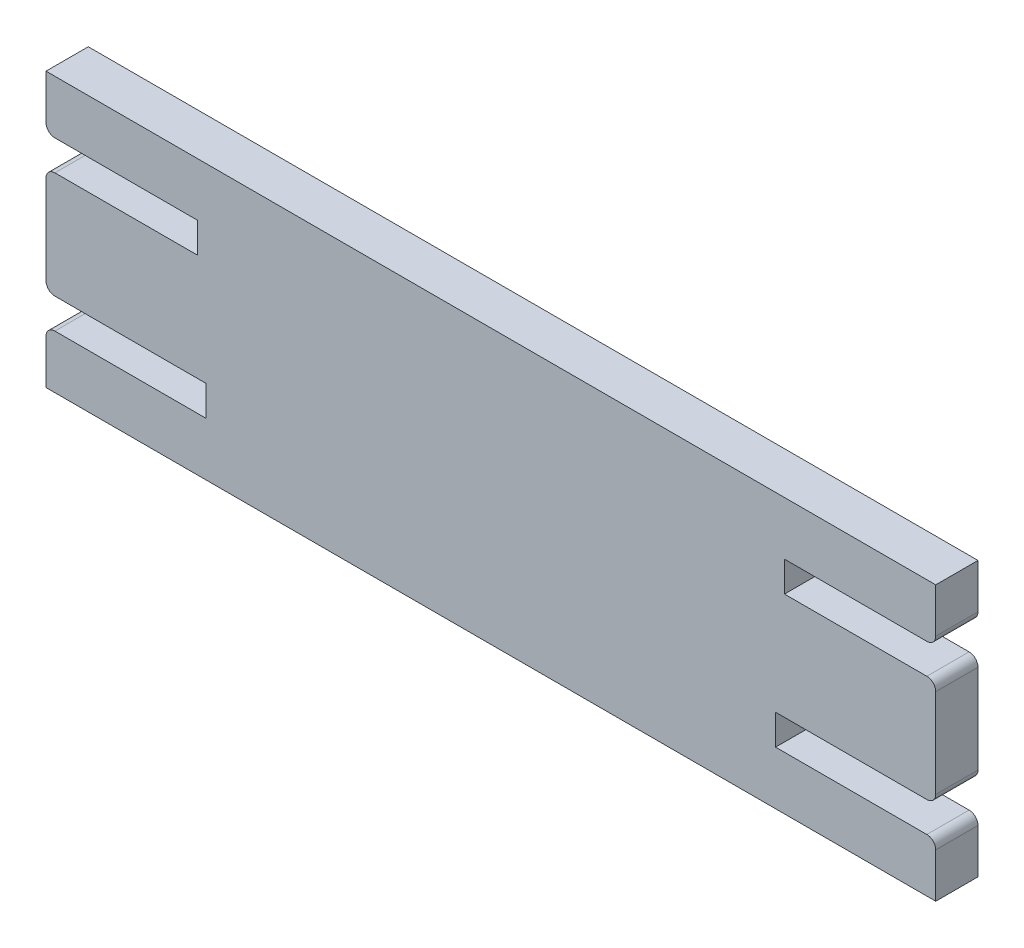
ISO-10303-21;
HEADER;
FILE_DESCRIPTION(('STEP AP214'),'2;1');
FILE_NAME('part.step','',(''),(''),'','','');
FILE_SCHEMA(('AUTOMOTIVE_DESIGN { 1 0 10303 214 1 1 1 1 }'));
ENDSEC;
DATA;
#1=APPLICATION_CONTEXT('core data for automotive mechanical design processes');
#2=APPLICATION_PROTOCOL_DEFINITION('international standard','automotive_design',2000,#1);
#3=PRODUCT_CONTEXT('',#1,'mechanical');
#4=PRODUCT('Part','Part','',(#3));
#5=PRODUCT_RELATED_PRODUCT_CATEGORY('part','',(#4));
#6=PRODUCT_DEFINITION_FORMATION('','',#4);
#7=PRODUCT_DEFINITION_CONTEXT('part definition',#1,'design');
#8=PRODUCT_DEFINITION('design','',#6,#7);
#9=PRODUCT_DEFINITION_SHAPE('','',#8);
#10=(LENGTH_UNIT() NAMED_UNIT(*) SI_UNIT(.MILLI.,.METRE.));
#11=(NAMED_UNIT(*) PLANE_ANGLE_UNIT() SI_UNIT($,.RADIAN.));
#12=(NAMED_UNIT(*) SI_UNIT($,.STERADIAN.) SOLID_ANGLE_UNIT());
#13=UNCERTAINTY_MEASURE_WITH_UNIT(LENGTH_MEASURE(1.E-05),#10,'distance_accuracy_value','');
#14=(GEOMETRIC_REPRESENTATION_CONTEXT(3) GLOBAL_UNCERTAINTY_ASSIGNED_CONTEXT((#13)) GLOBAL_UNIT_ASSIGNED_CONTEXT((#10,
#11,#12)) REPRESENTATION_CONTEXT('',''));
#15=CARTESIAN_POINT('',(0.,0.,0.));
#16=DIRECTION('',(0.,0.,1.));
#17=DIRECTION('',(1.,0.,0.));
#18=AXIS2_PLACEMENT_3D('',#15,#16,#17);
#19=CARTESIAN_POINT('',(-71.8945610328741,15.55,4.75));
#20=DIRECTION('',(1.,0.,0.));
#21=DIRECTION('',(0.,0.,-1.));
#22=AXIS2_PLACEMENT_3D('',#19,#20,#21);
#23=PLANE('',#22);
#24=DIRECTION('',(0.,-1.,0.));
#25=VECTOR('',#24,1.);
#26=CARTESIAN_POINT('',(-71.8945610328741,15.55,0.));
#27=LINE('',#26,#25);
#28=CARTESIAN_POINT('',(-71.8945610328741,15.55,0.));
#29=VERTEX_POINT('',#28);
#30=CARTESIAN_POINT('',(-71.8945610328741,10.55,0.));
#31=VERTEX_POINT('',#30);
#32=EDGE_CURVE('E249',#29,#31,#27,.T.);
#33=ORIENTED_EDGE('',*,*,#32,.T.);
#34=DIRECTION('',(0.,0.,-1.));
#35=VECTOR('',#34,1.);
#36=CARTESIAN_POINT('',(-71.8945610328741,10.55,4.75));
#37=LINE('',#36,#35);
#38=CARTESIAN_POINT('',(-71.8945610328741,10.55,4.75));
#39=VERTEX_POINT('',#38);
#40=EDGE_CURVE('E11',#39,#31,#37,.T.);
#41=ORIENTED_EDGE('',*,*,#40,.F.);
#42=DIRECTION('',(0.,-1.,0.));
#43=VECTOR('',#42,1.);
#44=CARTESIAN_POINT('',(-71.8945610328741,15.55,4.75));
#45=LINE('',#44,#43);
#46=CARTESIAN_POINT('',(-71.8945610328741,15.55,4.75));
#47=VERTEX_POINT('',#46);
#48=EDGE_CURVE('E303',#47,#39,#45,.T.);
#49=ORIENTED_EDGE('',*,*,#48,.F.);
#50=DIRECTION('',(0.,0.,-1.));
#51=VECTOR('',#50,1.);
#52=CARTESIAN_POINT('',(-71.8945610328741,15.55,4.75));
#53=LINE('',#52,#51);
#54=EDGE_CURVE('E245',#47,#29,#53,.T.);
#55=ORIENTED_EDGE('',*,*,#54,.T.);
#56=EDGE_LOOP('',(#33,#41,#49,#55));
#57=FACE_BOUND('',#56,.T.);
#58=ADVANCED_FACE('F33',(#57),#23,.F.);
#59=CARTESIAN_POINT('',(-70.8945610328741,10.55,4.75));
#60=DIRECTION('',(0.,0.,-1.));
#61=DIRECTION('',(-1.,0.,0.));
#62=AXIS2_PLACEMENT_3D('',#59,#60,#61);
#63=CYLINDRICAL_SURFACE('',#62,1.);
#64=CARTESIAN_POINT('',(-70.8945610328741,10.55,0.));
#65=DIRECTION('',(0.,0.,1.));
#66=DIRECTION('',(-1.,0.,0.));
#67=AXIS2_PLACEMENT_3D('',#64,#65,#66);
#68=CIRCLE('',#67,1.);
#69=CARTESIAN_POINT('',(-70.8945610328741,9.55,0.));
#70=VERTEX_POINT('',#69);
#71=EDGE_CURVE('E252',#31,#70,#68,.T.);
#72=ORIENTED_EDGE('',*,*,#71,.T.);
#73=DIRECTION('',(0.,0.,-1.));
#74=VECTOR('',#73,1.);
#75=CARTESIAN_POINT('',(-70.8945610328741,9.55,4.75));
#76=LINE('',#75,#74);
#77=CARTESIAN_POINT('',(-70.8945610328741,9.55,4.75));
#78=VERTEX_POINT('',#77);
#79=EDGE_CURVE('E41',#78,#70,#76,.T.);
#80=ORIENTED_EDGE('',*,*,#79,.F.);
#81=CARTESIAN_POINT('',(-70.8945610328741,10.55,4.75));
#82=DIRECTION('',(0.,0.,1.));
#83=DIRECTION('',(-1.,0.,0.));
#84=AXIS2_PLACEMENT_3D('',#81,#82,#83);
#85=CIRCLE('',#84,1.);
#86=EDGE_CURVE('E152',#39,#78,#85,.T.);
#87=ORIENTED_EDGE('',*,*,#86,.F.);
#88=ORIENTED_EDGE('',*,*,#40,.T.);
#89=EDGE_LOOP('',(#72,#80,#87,#88));
#90=FACE_BOUND('',#89,.T.);
#91=ADVANCED_FACE('F461',(#90),#63,.T.);
#92=CARTESIAN_POINT('',(-70.8945610328741,9.55,4.75));
#93=DIRECTION('',(0.,1.,0.));
#94=DIRECTION('',(0.,0.,1.));
#95=AXIS2_PLACEMENT_3D('',#92,#93,#94);
#96=PLANE('',#95);
#97=DIRECTION('',(1.,0.,0.));
#98=VECTOR('',#97,1.);
#99=CARTESIAN_POINT('',(-70.8945610328741,9.55,0.));
#100=LINE('',#99,#98);
#101=CARTESIAN_POINT('',(-54.8945610328741,9.55,0.));
#102=VERTEX_POINT('',#101);
#103=EDGE_CURVE('E254',#70,#102,#100,.T.);
#104=ORIENTED_EDGE('',*,*,#103,.T.);
#105=DIRECTION('',(0.,0.,-1.));
#106=VECTOR('',#105,1.);
#107=CARTESIAN_POINT('',(-54.8945610328741,9.55,4.75));
#108=LINE('',#107,#106);
#109=CARTESIAN_POINT('',(-54.8945610328741,9.55,4.75));
#110=VERTEX_POINT('',#109);
#111=EDGE_CURVE('E370',#110,#102,#108,.T.);
#112=ORIENTED_EDGE('',*,*,#111,.F.);
#113=DIRECTION('',(1.,0.,0.));
#114=VECTOR('',#113,1.);
#115=CARTESIAN_POINT('',(-70.8945610328741,9.55,4.75));
#116=LINE('',#115,#114);
#117=EDGE_CURVE('E378',#78,#110,#116,.T.);
#118=ORIENTED_EDGE('',*,*,#117,.F.);
#119=ORIENTED_EDGE('',*,*,#79,.T.);
#120=EDGE_LOOP('',(#104,#112,#118,#119));
#121=FACE_BOUND('',#120,.T.);
#122=ADVANCED_FACE('F376',(#121),#96,.F.);
#123=CARTESIAN_POINT('',(-54.8945610328741,9.55,4.75));
#124=DIRECTION('',(1.,0.,0.));
#125=DIRECTION('',(0.,0.,-1.));
#126=AXIS2_PLACEMENT_3D('',#123,#124,#125);
#127=PLANE('',#126);
#128=DIRECTION('',(0.,-1.,0.));
#129=VECTOR('',#128,1.);
#130=CARTESIAN_POINT('',(-54.8945610328741,9.55,0.));
#131=LINE('',#130,#129);
#132=CARTESIAN_POINT('',(-54.8945610328741,6.15,0.));
#133=VERTEX_POINT('',#132);
#134=EDGE_CURVE('E256',#102,#133,#131,.T.);
#135=ORIENTED_EDGE('',*,*,#134,.T.);
#136=DIRECTION('',(0.,0.,-1.));
#137=VECTOR('',#136,1.);
#138=CARTESIAN_POINT('',(-54.8945610328741,6.15,4.75));
#139=LINE('',#138,#137);
#140=CARTESIAN_POINT('',(-54.8945610328741,6.15,4.75));
#141=VERTEX_POINT('',#140);
#142=EDGE_CURVE('E367',#141,#133,#139,.T.);
#143=ORIENTED_EDGE('',*,*,#142,.F.);
#144=DIRECTION('',(0.,-1.,0.));
#145=VECTOR('',#144,1.);
#146=CARTESIAN_POINT('',(-54.8945610328741,9.55,4.75));
#147=LINE('',#146,#145);
#148=EDGE_CURVE('E396',#110,#141,#147,.T.);
#149=ORIENTED_EDGE('',*,*,#148,.F.);
#150=ORIENTED_EDGE('',*,*,#111,.T.);
#151=EDGE_LOOP('',(#135,#143,#149,#150));
#152=FACE_BOUND('',#151,.T.);
#153=ADVANCED_FACE('F387',(#152),#127,.F.);
#154=CARTESIAN_POINT('',(-54.8945610328741,6.15,4.75));
#155=DIRECTION('',(0.,-1.,0.));
#156=DIRECTION('',(1.,0.,0.));
#157=AXIS2_PLACEMENT_3D('',#154,#155,#156);
#158=PLANE('',#157);
#159=DIRECTION('',(-1.,0.,0.));
#160=VECTOR('',#159,1.);
#161=CARTESIAN_POINT('',(-54.8945610328741,6.15,0.));
#162=LINE('',#161,#160);
#163=CARTESIAN_POINT('',(-70.8945610328741,6.15,0.));
#164=VERTEX_POINT('',#163);
#165=EDGE_CURVE('E258',#133,#164,#162,.T.);
#166=ORIENTED_EDGE('',*,*,#165,.T.);
#167=DIRECTION('',(0.,0.,-1.));
#168=VECTOR('',#167,1.);
#169=CARTESIAN_POINT('',(-70.8945610328741,6.15,4.75));
#170=LINE('',#169,#168);
#171=CARTESIAN_POINT('',(-70.8945610328741,6.15,4.75));
#172=VERTEX_POINT('',#171);
#173=EDGE_CURVE('E364',#172,#164,#170,.T.);
#174=ORIENTED_EDGE('',*,*,#173,.F.);
#175=DIRECTION('',(-1.,0.,0.));
#176=VECTOR('',#175,1.);
#177=CARTESIAN_POINT('',(-54.8945610328741,6.15,4.75));
#178=LINE('',#177,#176);
#179=EDGE_CURVE('E393',#141,#172,#178,.T.);
#180=ORIENTED_EDGE('',*,*,#179,.F.);
#181=ORIENTED_EDGE('',*,*,#142,.T.);
#182=EDGE_LOOP('',(#166,#174,#180,#181));
#183=FACE_BOUND('',#182,.T.);
#184=ADVANCED_FACE('F391',(#183),#158,.F.);
#185=CARTESIAN_POINT('',(-70.8945610328741,5.15,4.75));
#186=DIRECTION('',(0.,0.,-1.));
#187=DIRECTION('',(-1.,0.,0.));
#188=AXIS2_PLACEMENT_3D('',#185,#186,#187);
#189=CYLINDRICAL_SURFACE('',#188,1.);
#190=CARTESIAN_POINT('',(-70.8945610328741,5.15,0.));
#191=DIRECTION('',(0.,0.,1.));
#192=DIRECTION('',(1.,0.,0.));
#193=AXIS2_PLACEMENT_3D('',#190,#191,#192);
#194=CIRCLE('',#193,1.);
#195=CARTESIAN_POINT('',(-71.8945610328741,5.15,0.));
#196=VERTEX_POINT('',#195);
#197=EDGE_CURVE('E260',#164,#196,#194,.T.);
#198=ORIENTED_EDGE('',*,*,#197,.T.);
#199=DIRECTION('',(0.,0.,-1.));
#200=VECTOR('',#199,1.);
#201=CARTESIAN_POINT('',(-71.8945610328741,5.15,4.75));
#202=LINE('',#201,#200);
#203=CARTESIAN_POINT('',(-71.8945610328741,5.15,4.75));
#204=VERTEX_POINT('',#203);
#205=EDGE_CURVE('E361',#204,#196,#202,.T.);
#206=ORIENTED_EDGE('',*,*,#205,.F.);
#207=CARTESIAN_POINT('',(-70.8945610328741,5.15,4.75));
#208=DIRECTION('',(0.,0.,1.));
#209=DIRECTION('',(1.,0.,0.));
#210=AXIS2_PLACEMENT_3D('',#207,#208,#209);
#211=CIRCLE('',#210,1.);
#212=EDGE_CURVE('E395',#172,#204,#211,.T.);
#213=ORIENTED_EDGE('',*,*,#212,.F.);
#214=ORIENTED_EDGE('',*,*,#173,.T.);
#215=EDGE_LOOP('',(#198,#206,#213,#214));
#216=FACE_BOUND('',#215,.T.);
#217=ADVANCED_FACE('F474',(#216),#189,.T.);
#218=CARTESIAN_POINT('',(-71.8945610328741,5.15,4.75));
#219=DIRECTION('',(1.,0.,0.));
#220=DIRECTION('',(0.,0.,-1.));
#221=AXIS2_PLACEMENT_3D('',#218,#219,#220);
#222=PLANE('',#221);
#223=DIRECTION('',(0.,-1.,0.));
#224=VECTOR('',#223,1.);
#225=CARTESIAN_POINT('',(-71.8945610328741,5.15,0.));
#226=LINE('',#225,#224);
#227=CARTESIAN_POINT('',(-71.8945610328741,-4.85,0.));
#228=VERTEX_POINT('',#227);
#229=EDGE_CURVE('E262',#196,#228,#226,.T.);
#230=ORIENTED_EDGE('',*,*,#229,.T.);
#231=DIRECTION('',(0.,0.,-1.));
#232=VECTOR('',#231,1.);
#233=CARTESIAN_POINT('',(-71.8945610328741,-4.85,4.75));
#234=LINE('',#233,#232);
#235=CARTESIAN_POINT('',(-71.8945610328741,-4.85,4.75));
#236=VERTEX_POINT('',#235);
#237=EDGE_CURVE('E358',#236,#228,#234,.T.);
#238=ORIENTED_EDGE('',*,*,#237,.F.);
#239=DIRECTION('',(0.,-1.,0.));
#240=VECTOR('',#239,1.);
#241=CARTESIAN_POINT('',(-71.8945610328741,5.15,4.75));
#242=LINE('',#241,#240);
#243=EDGE_CURVE('E398',#204,#236,#242,.T.);
#244=ORIENTED_EDGE('',*,*,#243,.F.);
#245=ORIENTED_EDGE('',*,*,#205,.T.);
#246=EDGE_LOOP('',(#230,#238,#244,#245));
#247=FACE_BOUND('',#246,.T.);
#248=ADVANCED_FACE('F477',(#247),#222,.F.);
#249=CARTESIAN_POINT('',(-70.8945610328741,-4.85,4.75));
#250=DIRECTION('',(0.,0.,-1.));
#251=DIRECTION('',(-1.,0.,0.));
#252=AXIS2_PLACEMENT_3D('',#249,#250,#251);
#253=CYLINDRICAL_SURFACE('',#252,1.);
#254=CARTESIAN_POINT('',(-70.8945610328741,-4.85,0.));
#255=DIRECTION('',(0.,0.,1.));
#256=DIRECTION('',(-1.,0.,0.));
#257=AXIS2_PLACEMENT_3D('',#254,#255,#256);
#258=CIRCLE('',#257,1.);
#259=CARTESIAN_POINT('',(-70.8945610328741,-5.85,0.));
#260=VERTEX_POINT('',#259);
#261=EDGE_CURVE('E264',#228,#260,#258,.T.);
#262=ORIENTED_EDGE('',*,*,#261,.T.);
#263=DIRECTION('',(0.,0.,-1.));
#264=VECTOR('',#263,1.);
#265=CARTESIAN_POINT('',(-70.8945610328741,-5.85,4.75));
#266=LINE('',#265,#264);
#267=CARTESIAN_POINT('',(-70.8945610328741,-5.85,4.75));
#268=VERTEX_POINT('',#267);
#269=EDGE_CURVE('E355',#268,#260,#266,.T.);
#270=ORIENTED_EDGE('',*,*,#269,.F.);
#271=CARTESIAN_POINT('',(-70.8945610328741,-4.85,4.75));
#272=DIRECTION('',(0.,0.,1.));
#273=DIRECTION('',(-1.,0.,0.));
#274=AXIS2_PLACEMENT_3D('',#271,#272,#273);
#275=CIRCLE('',#274,1.);
#276=EDGE_CURVE('E404',#236,#268,#275,.T.);
#277=ORIENTED_EDGE('',*,*,#276,.F.);
#278=ORIENTED_EDGE('',*,*,#237,.T.);
#279=EDGE_LOOP('',(#262,#270,#277,#278));
#280=FACE_BOUND('',#279,.T.);
#281=ADVANCED_FACE('F481',(#280),#253,.T.);
#282=CARTESIAN_POINT('',(-53.8945610328741,-5.85,4.75));
#283=DIRECTION('',(0.,1.,0.));
#284=DIRECTION('',(0.,0.,1.));
#285=AXIS2_PLACEMENT_3D('',#282,#283,#284);
#286=PLANE('',#285);
#287=DIRECTION('',(1.,0.,0.));
#288=VECTOR('',#287,1.);
#289=CARTESIAN_POINT('',(-53.8945610328741,-5.85,0.));
#290=LINE('',#289,#288);
#291=CARTESIAN_POINT('',(-53.8945610328741,-5.85,0.));
#292=VERTEX_POINT('',#291);
#293=EDGE_CURVE('E266',#260,#292,#290,.T.);
#294=ORIENTED_EDGE('',*,*,#293,.T.);
#295=DIRECTION('',(0.,0.,-1.));
#296=VECTOR('',#295,1.);
#297=CARTESIAN_POINT('',(-53.8945610328741,-5.85,4.75));
#298=LINE('',#297,#296);
#299=CARTESIAN_POINT('',(-53.8945610328741,-5.85,4.75));
#300=VERTEX_POINT('',#299);
#301=EDGE_CURVE('E352',#300,#292,#298,.T.);
#302=ORIENTED_EDGE('',*,*,#301,.F.);
#303=DIRECTION('',(1.,0.,0.));
#304=VECTOR('',#303,1.);
#305=CARTESIAN_POINT('',(-53.8945610328741,-5.85,4.75));
#306=LINE('',#305,#304);
#307=EDGE_CURVE('E406',#268,#300,#306,.T.);
#308=ORIENTED_EDGE('',*,*,#307,.F.);
#309=ORIENTED_EDGE('',*,*,#269,.T.);
#310=EDGE_LOOP('',(#294,#302,#308,#309));
#311=FACE_BOUND('',#310,.T.);
#312=ADVANCED_FACE('F485',(#311),#286,.F.);
#313=CARTESIAN_POINT('',(-53.8945610328741,-9.25,4.75));
#314=DIRECTION('',(1.,0.,0.));
#315=DIRECTION('',(0.,0.,-1.));
#316=AXIS2_PLACEMENT_3D('',#313,#314,#315);
#317=PLANE('',#316);
#318=DIRECTION('',(0.,-1.,0.));
#319=VECTOR('',#318,1.);
#320=CARTESIAN_POINT('',(-53.8945610328741,-9.25,0.));
#321=LINE('',#320,#319);
#322=CARTESIAN_POINT('',(-53.8945610328741,-9.25,0.));
#323=VERTEX_POINT('',#322);
#324=EDGE_CURVE('E268',#292,#323,#321,.T.);
#325=ORIENTED_EDGE('',*,*,#324,.T.);
#326=DIRECTION('',(0.,0.,-1.));
#327=VECTOR('',#326,1.);
#328=CARTESIAN_POINT('',(-53.8945610328741,-9.25,4.75));
#329=LINE('',#328,#327);
#330=CARTESIAN_POINT('',(-53.8945610328741,-9.25,4.75));
#331=VERTEX_POINT('',#330);
#332=EDGE_CURVE('E349',#331,#323,#329,.T.);
#333=ORIENTED_EDGE('',*,*,#332,.F.);
#334=DIRECTION('',(0.,-1.,0.));
#335=VECTOR('',#334,1.);
#336=CARTESIAN_POINT('',(-53.8945610328741,-9.25,4.75));
#337=LINE('',#336,#335);
#338=EDGE_CURVE('E408',#300,#331,#337,.T.);
#339=ORIENTED_EDGE('',*,*,#338,.F.);
#340=ORIENTED_EDGE('',*,*,#301,.T.);
#341=EDGE_LOOP('',(#325,#333,#339,#340));
#342=FACE_BOUND('',#341,.T.);
#343=ADVANCED_FACE('F489',(#342),#317,.F.);
#344=CARTESIAN_POINT('',(-70.8945610328741,-9.25,4.75));
#345=DIRECTION('',(0.,-1.,0.));
#346=DIRECTION('',(0.,0.,-1.));
#347=AXIS2_PLACEMENT_3D('',#344,#345,#346);
#348=PLANE('',#347);
#349=DIRECTION('',(-1.,0.,0.));
#350=VECTOR('',#349,1.);
#351=CARTESIAN_POINT('',(-70.8945610328741,-9.25,0.));
#352=LINE('',#351,#350);
#353=CARTESIAN_POINT('',(-70.8945610328741,-9.25,0.));
#354=VERTEX_POINT('',#353);
#355=EDGE_CURVE('E270',#323,#354,#352,.T.);
#356=ORIENTED_EDGE('',*,*,#355,.T.);
#357=DIRECTION('',(0.,0.,-1.));
#358=VECTOR('',#357,1.);
#359=CARTESIAN_POINT('',(-70.8945610328741,-9.25,4.75));
#360=LINE('',#359,#358);
#361=CARTESIAN_POINT('',(-70.8945610328741,-9.25,4.75));
#362=VERTEX_POINT('',#361);
#363=EDGE_CURVE('E346',#362,#354,#360,.T.);
#364=ORIENTED_EDGE('',*,*,#363,.F.);
#365=DIRECTION('',(-1.,0.,0.));
#366=VECTOR('',#365,1.);
#367=CARTESIAN_POINT('',(-70.8945610328741,-9.25,4.75));
#368=LINE('',#367,#366);
#369=EDGE_CURVE('E410',#331,#362,#368,.T.);
#370=ORIENTED_EDGE('',*,*,#369,.F.);
#371=ORIENTED_EDGE('',*,*,#332,.T.);
#372=EDGE_LOOP('',(#356,#364,#370,#371));
#373=FACE_BOUND('',#372,.T.);
#374=ADVANCED_FACE('F493',(#373),#348,.F.);
#375=CARTESIAN_POINT('',(-70.8945610328741,-10.25,4.75));
#376=DIRECTION('',(0.,0.,-1.));
#377=DIRECTION('',(-1.,0.,0.));
#378=AXIS2_PLACEMENT_3D('',#375,#376,#377);
#379=CYLINDRICAL_SURFACE('',#378,1.);
#380=CARTESIAN_POINT('',(-70.8945610328741,-10.25,0.));
#381=DIRECTION('',(0.,0.,1.));
#382=DIRECTION('',(1.,0.,0.));
#383=AXIS2_PLACEMENT_3D('',#380,#381,#382);
#384=CIRCLE('',#383,1.);
#385=CARTESIAN_POINT('',(-71.8945610328741,-10.25,0.));
#386=VERTEX_POINT('',#385);
#387=EDGE_CURVE('E272',#354,#386,#384,.T.);
#388=ORIENTED_EDGE('',*,*,#387,.T.);
#389=DIRECTION('',(0.,0.,-1.));
#390=VECTOR('',#389,1.);
#391=CARTESIAN_POINT('',(-71.8945610328741,-10.25,4.75));
#392=LINE('',#391,#390);
#393=CARTESIAN_POINT('',(-71.8945610328741,-10.25,4.75));
#394=VERTEX_POINT('',#393);
#395=EDGE_CURVE('E343',#394,#386,#392,.T.);
#396=ORIENTED_EDGE('',*,*,#395,.F.);
#397=CARTESIAN_POINT('',(-70.8945610328741,-10.25,4.75));
#398=DIRECTION('',(0.,0.,1.));
#399=DIRECTION('',(1.,0.,0.));
#400=AXIS2_PLACEMENT_3D('',#397,#398,#399);
#401=CIRCLE('',#400,1.);
#402=EDGE_CURVE('E412',#362,#394,#401,.T.);
#403=ORIENTED_EDGE('',*,*,#402,.F.);
#404=ORIENTED_EDGE('',*,*,#363,.T.);
#405=EDGE_LOOP('',(#388,#396,#403,#404));
#406=FACE_BOUND('',#405,.T.);
#407=ADVANCED_FACE('F497',(#406),#379,.T.);
#408=CARTESIAN_POINT('',(-71.8945610328741,-10.25,4.75));
#409=DIRECTION('',(1.,0.,0.));
#410=DIRECTION('',(0.,0.,-1.));
#411=AXIS2_PLACEMENT_3D('',#408,#409,#410);
#412=PLANE('',#411);
#413=DIRECTION('',(0.,-1.,0.));
#414=VECTOR('',#413,1.);
#415=CARTESIAN_POINT('',(-71.8945610328741,-10.25,0.));
#416=LINE('',#415,#414);
#417=CARTESIAN_POINT('',(-71.8945610328741,-15.25,0.));
#418=VERTEX_POINT('',#417);
#419=EDGE_CURVE('E274',#386,#418,#416,.T.);
#420=ORIENTED_EDGE('',*,*,#419,.T.);
#421=DIRECTION('',(0.,0.,-1.));
#422=VECTOR('',#421,1.);
#423=CARTESIAN_POINT('',(-71.8945610328741,-15.25,4.75));
#424=LINE('',#423,#422);
#425=CARTESIAN_POINT('',(-71.8945610328741,-15.25,4.75));
#426=VERTEX_POINT('',#425);
#427=EDGE_CURVE('E340',#426,#418,#424,.T.);
#428=ORIENTED_EDGE('',*,*,#427,.F.);
#429=DIRECTION('',(0.,-1.,0.));
#430=VECTOR('',#429,1.);
#431=CARTESIAN_POINT('',(-71.8945610328741,-10.25,4.75));
#432=LINE('',#431,#430);
#433=EDGE_CURVE('E414',#394,#426,#432,.T.);
#434=ORIENTED_EDGE('',*,*,#433,.F.);
#435=ORIENTED_EDGE('',*,*,#395,.T.);
#436=EDGE_LOOP('',(#420,#428,#434,#435));
#437=FACE_BOUND('',#436,.T.);
#438=ADVANCED_FACE('F501',(#437),#412,.F.);
#439=CARTESIAN_POINT('',(-71.8945610328741,-15.25,4.75));
#440=DIRECTION('',(0.,1.,0.));
#441=DIRECTION('',(0.,0.,1.));
#442=AXIS2_PLACEMENT_3D('',#439,#440,#441);
#443=PLANE('',#442);
#444=DIRECTION('',(1.,0.,0.));
#445=VECTOR('',#444,1.);
#446=CARTESIAN_POINT('',(-71.8945610328741,-15.25,0.));
#447=LINE('',#446,#445);
#448=CARTESIAN_POINT('',(28.1054389671259,-15.25,0.));
#449=VERTEX_POINT('',#448);
#450=EDGE_CURVE('E276',#418,#449,#447,.T.);
#451=ORIENTED_EDGE('',*,*,#450,.T.);
#452=DIRECTION('',(0.,0.,-1.));
#453=VECTOR('',#452,1.);
#454=CARTESIAN_POINT('',(28.1054389671259,-15.25,4.75));
#455=LINE('',#454,#453);
#456=CARTESIAN_POINT('',(28.1054389671259,-15.25,4.75));
#457=VERTEX_POINT('',#456);
#458=EDGE_CURVE('E337',#457,#449,#455,.T.);
#459=ORIENTED_EDGE('',*,*,#458,.F.);
#460=DIRECTION('',(1.,0.,0.));
#461=VECTOR('',#460,1.);
#462=CARTESIAN_POINT('',(-71.8945610328741,-15.25,4.75));
#463=LINE('',#462,#461);
#464=EDGE_CURVE('E416',#426,#457,#463,.T.);
#465=ORIENTED_EDGE('',*,*,#464,.F.);
#466=ORIENTED_EDGE('',*,*,#427,.T.);
#467=EDGE_LOOP('',(#451,#459,#465,#466));
#468=FACE_BOUND('',#467,.T.);
#469=ADVANCED_FACE('F505',(#468),#443,.F.);
#470=CARTESIAN_POINT('',(28.1054389671259,-10.25,4.75));
#471=DIRECTION('',(-1.,0.,0.));
#472=DIRECTION('',(0.,0.,1.));
#473=AXIS2_PLACEMENT_3D('',#470,#471,#472);
#474=PLANE('',#473);
#475=DIRECTION('',(0.,1.,0.));
#476=VECTOR('',#475,1.);
#477=CARTESIAN_POINT('',(28.1054389671259,-10.25,0.));
#478=LINE('',#477,#476);
#479=CARTESIAN_POINT('',(28.1054389671259,-10.25,0.));
#480=VERTEX_POINT('',#479);
#481=EDGE_CURVE('E278',#449,#480,#478,.T.);
#482=ORIENTED_EDGE('',*,*,#481,.T.);
#483=DIRECTION('',(0.,0.,-1.));
#484=VECTOR('',#483,1.);
#485=CARTESIAN_POINT('',(28.1054389671259,-10.25,4.75));
#486=LINE('',#485,#484);
#487=CARTESIAN_POINT('',(28.1054389671259,-10.25,4.75));
#488=VERTEX_POINT('',#487);
#489=EDGE_CURVE('E334',#488,#480,#486,.T.);
#490=ORIENTED_EDGE('',*,*,#489,.F.);
#491=DIRECTION('',(0.,1.,0.));
#492=VECTOR('',#491,1.);
#493=CARTESIAN_POINT('',(28.1054389671259,-10.25,4.75));
#494=LINE('',#493,#492);
#495=EDGE_CURVE('E418',#457,#488,#494,.T.);
#496=ORIENTED_EDGE('',*,*,#495,.F.);
#497=ORIENTED_EDGE('',*,*,#458,.T.);
#498=EDGE_LOOP('',(#482,#490,#496,#497));
#499=FACE_BOUND('',#498,.T.);
#500=ADVANCED_FACE('F509',(#499),#474,.F.);
#501=CARTESIAN_POINT('',(27.1054389671259,-10.25,4.75));
#502=DIRECTION('',(0.,0.,-1.));
#503=DIRECTION('',(-1.,0.,0.));
#504=AXIS2_PLACEMENT_3D('',#501,#502,#503);
#505=CYLINDRICAL_SURFACE('',#504,1.);
#506=CARTESIAN_POINT('',(27.1054389671259,-10.25,0.));
#507=DIRECTION('',(0.,0.,1.));
#508=DIRECTION('',(-1.,0.,0.));
#509=AXIS2_PLACEMENT_3D('',#506,#507,#508);
#510=CIRCLE('',#509,1.);
#511=CARTESIAN_POINT('',(27.1054389671259,-9.25,0.));
#512=VERTEX_POINT('',#511);
#513=EDGE_CURVE('E280',#480,#512,#510,.T.);
#514=ORIENTED_EDGE('',*,*,#513,.T.);
#515=DIRECTION('',(0.,0.,-1.));
#516=VECTOR('',#515,1.);
#517=CARTESIAN_POINT('',(27.1054389671259,-9.25,4.75));
#518=LINE('',#517,#516);
#519=CARTESIAN_POINT('',(27.1054389671259,-9.25,4.75));
#520=VERTEX_POINT('',#519);
#521=EDGE_CURVE('E331',#520,#512,#518,.T.);
#522=ORIENTED_EDGE('',*,*,#521,.F.);
#523=CARTESIAN_POINT('',(27.1054389671259,-10.25,4.75));
#524=DIRECTION('',(0.,0.,1.));
#525=DIRECTION('',(-1.,0.,0.));
#526=AXIS2_PLACEMENT_3D('',#523,#524,#525);
#527=CIRCLE('',#526,1.);
#528=EDGE_CURVE('E420',#488,#520,#527,.T.);
#529=ORIENTED_EDGE('',*,*,#528,.F.);
#530=ORIENTED_EDGE('',*,*,#489,.T.);
#531=EDGE_LOOP('',(#514,#522,#529,#530));
#532=FACE_BOUND('',#531,.T.);
#533=ADVANCED_FACE('F513',(#532),#505,.T.);
#534=CARTESIAN_POINT('',(27.1054389671259,-9.25,4.75));
#535=DIRECTION('',(0.,-1.,0.));
#536=DIRECTION('',(0.,0.,-1.));
#537=AXIS2_PLACEMENT_3D('',#534,#535,#536);
#538=PLANE('',#537);
#539=DIRECTION('',(-1.,0.,0.));
#540=VECTOR('',#539,1.);
#541=CARTESIAN_POINT('',(27.1054389671259,-9.25,0.));
#542=LINE('',#541,#540);
#543=CARTESIAN_POINT('',(10.1054389671259,-9.25,0.));
#544=VERTEX_POINT('',#543);
#545=EDGE_CURVE('E282',#512,#544,#542,.T.);
#546=ORIENTED_EDGE('',*,*,#545,.T.);
#547=DIRECTION('',(0.,0.,-1.));
#548=VECTOR('',#547,1.);
#549=CARTESIAN_POINT('',(10.1054389671259,-9.25,4.75));
#550=LINE('',#549,#548);
#551=CARTESIAN_POINT('',(10.1054389671259,-9.25,4.75));
#552=VERTEX_POINT('',#551);
#553=EDGE_CURVE('E328',#552,#544,#550,.T.);
#554=ORIENTED_EDGE('',*,*,#553,.F.);
#555=DIRECTION('',(-1.,0.,0.));
#556=VECTOR('',#555,1.);
#557=CARTESIAN_POINT('',(27.1054389671259,-9.25,4.75));
#558=LINE('',#557,#556);
#559=EDGE_CURVE('E422',#520,#552,#558,.T.);
#560=ORIENTED_EDGE('',*,*,#559,.F.);
#561=ORIENTED_EDGE('',*,*,#521,.T.);
#562=EDGE_LOOP('',(#546,#554,#560,#561));
#563=FACE_BOUND('',#562,.T.);
#564=ADVANCED_FACE('F517',(#563),#538,.F.);
#565=CARTESIAN_POINT('',(10.1054389671259,-9.25,4.75));
#566=DIRECTION('',(-1.,0.,0.));
#567=DIRECTION('',(0.,0.,1.));
#568=AXIS2_PLACEMENT_3D('',#565,#566,#567);
#569=PLANE('',#568);
#570=DIRECTION('',(0.,1.,0.));
#571=VECTOR('',#570,1.);
#572=CARTESIAN_POINT('',(10.1054389671259,-9.25,0.));
#573=LINE('',#572,#571);
#574=CARTESIAN_POINT('',(10.1054389671259,-5.85,0.));
#575=VERTEX_POINT('',#574);
#576=EDGE_CURVE('E284',#544,#575,#573,.T.);
#577=ORIENTED_EDGE('',*,*,#576,.T.);
#578=DIRECTION('',(0.,0.,-1.));
#579=VECTOR('',#578,1.);
#580=CARTESIAN_POINT('',(10.1054389671259,-5.85,4.75));
#581=LINE('',#580,#579);
#582=CARTESIAN_POINT('',(10.1054389671259,-5.85,4.75));
#583=VERTEX_POINT('',#582);
#584=EDGE_CURVE('E325',#583,#575,#581,.T.);
#585=ORIENTED_EDGE('',*,*,#584,.F.);
#586=DIRECTION('',(0.,1.,0.));
#587=VECTOR('',#586,1.);
#588=CARTESIAN_POINT('',(10.1054389671259,-9.25,4.75));
#589=LINE('',#588,#587);
#590=EDGE_CURVE('E424',#552,#583,#589,.T.);
#591=ORIENTED_EDGE('',*,*,#590,.F.);
#592=ORIENTED_EDGE('',*,*,#553,.T.);
#593=EDGE_LOOP('',(#577,#585,#591,#592));
#594=FACE_BOUND('',#593,.T.);
#595=ADVANCED_FACE('F521',(#594),#569,.F.);
#596=CARTESIAN_POINT('',(10.1054389671259,-5.85,4.75));
#597=DIRECTION('',(0.,1.,0.));
#598=DIRECTION('',(0.,0.,1.));
#599=AXIS2_PLACEMENT_3D('',#596,#597,#598);
#600=PLANE('',#599);
#601=DIRECTION('',(1.,0.,0.));
#602=VECTOR('',#601,1.);
#603=CARTESIAN_POINT('',(10.1054389671259,-5.85,0.));
#604=LINE('',#603,#602);
#605=CARTESIAN_POINT('',(27.1054389671259,-5.85,0.));
#606=VERTEX_POINT('',#605);
#607=EDGE_CURVE('E286',#575,#606,#604,.T.);
#608=ORIENTED_EDGE('',*,*,#607,.T.);
#609=DIRECTION('',(0.,0.,-1.));
#610=VECTOR('',#609,1.);
#611=CARTESIAN_POINT('',(27.1054389671259,-5.85,4.75));
#612=LINE('',#611,#610);
#613=CARTESIAN_POINT('',(27.1054389671259,-5.85,4.75));
#614=VERTEX_POINT('',#613);
#615=EDGE_CURVE('E322',#614,#606,#612,.T.);
#616=ORIENTED_EDGE('',*,*,#615,.F.);
#617=DIRECTION('',(1.,0.,0.));
#618=VECTOR('',#617,1.);
#619=CARTESIAN_POINT('',(10.1054389671259,-5.85,4.75));
#620=LINE('',#619,#618);
#621=EDGE_CURVE('E426',#583,#614,#620,.T.);
#622=ORIENTED_EDGE('',*,*,#621,.F.);
#623=ORIENTED_EDGE('',*,*,#584,.T.);
#624=EDGE_LOOP('',(#608,#616,#622,#623));
#625=FACE_BOUND('',#624,.T.);
#626=ADVANCED_FACE('F525',(#625),#600,.F.);
#627=CARTESIAN_POINT('',(27.1054389671259,-4.85,4.75));
#628=DIRECTION('',(0.,0.,-1.));
#629=DIRECTION('',(-1.,0.,0.));
#630=AXIS2_PLACEMENT_3D('',#627,#628,#629);
#631=CYLINDRICAL_SURFACE('',#630,1.);
#632=CARTESIAN_POINT('',(27.1054389671259,-4.85,0.));
#633=DIRECTION('',(0.,0.,1.));
#634=DIRECTION('',(1.,0.,0.));
#635=AXIS2_PLACEMENT_3D('',#632,#633,#634);
#636=CIRCLE('',#635,1.);
#637=CARTESIAN_POINT('',(28.1054389671259,-4.85,0.));
#638=VERTEX_POINT('',#637);
#639=EDGE_CURVE('E288',#606,#638,#636,.T.);
#640=ORIENTED_EDGE('',*,*,#639,.T.);
#641=DIRECTION('',(0.,0.,-1.));
#642=VECTOR('',#641,1.);
#643=CARTESIAN_POINT('',(28.1054389671259,-4.85,4.75));
#644=LINE('',#643,#642);
#645=CARTESIAN_POINT('',(28.1054389671259,-4.85,4.75));
#646=VERTEX_POINT('',#645);
#647=EDGE_CURVE('E319',#646,#638,#644,.T.);
#648=ORIENTED_EDGE('',*,*,#647,.F.);
#649=CARTESIAN_POINT('',(27.1054389671259,-4.85,4.75));
#650=DIRECTION('',(0.,0.,1.));
#651=DIRECTION('',(1.,0.,0.));
#652=AXIS2_PLACEMENT_3D('',#649,#650,#651);
#653=CIRCLE('',#652,1.);
#654=EDGE_CURVE('E428',#614,#646,#653,.T.);
#655=ORIENTED_EDGE('',*,*,#654,.F.);
#656=ORIENTED_EDGE('',*,*,#615,.T.);
#657=EDGE_LOOP('',(#640,#648,#655,#656));
#658=FACE_BOUND('',#657,.T.);
#659=ADVANCED_FACE('F529',(#658),#631,.T.);
#660=CARTESIAN_POINT('',(28.1054389671259,5.15,4.75));
#661=DIRECTION('',(-1.,0.,0.));
#662=DIRECTION('',(0.,0.,1.));
#663=AXIS2_PLACEMENT_3D('',#660,#661,#662);
#664=PLANE('',#663);
#665=DIRECTION('',(0.,1.,0.));
#666=VECTOR('',#665,1.);
#667=CARTESIAN_POINT('',(28.1054389671259,5.15,0.));
#668=LINE('',#667,#666);
#669=CARTESIAN_POINT('',(28.1054389671259,5.15,0.));
#670=VERTEX_POINT('',#669);
#671=EDGE_CURVE('E290',#638,#670,#668,.T.);
#672=ORIENTED_EDGE('',*,*,#671,.T.);
#673=DIRECTION('',(0.,0.,-1.));
#674=VECTOR('',#673,1.);
#675=CARTESIAN_POINT('',(28.1054389671259,5.15,4.75));
#676=LINE('',#675,#674);
#677=CARTESIAN_POINT('',(28.1054389671259,5.15,4.75));
#678=VERTEX_POINT('',#677);
#679=EDGE_CURVE('E316',#678,#670,#676,.T.);
#680=ORIENTED_EDGE('',*,*,#679,.F.);
#681=DIRECTION('',(0.,1.,0.));
#682=VECTOR('',#681,1.);
#683=CARTESIAN_POINT('',(28.1054389671259,5.15,4.75));
#684=LINE('',#683,#682);
#685=EDGE_CURVE('E430',#646,#678,#684,.T.);
#686=ORIENTED_EDGE('',*,*,#685,.F.);
#687=ORIENTED_EDGE('',*,*,#647,.T.);
#688=EDGE_LOOP('',(#672,#680,#686,#687));
#689=FACE_BOUND('',#688,.T.);
#690=ADVANCED_FACE('F533',(#689),#664,.F.);
#691=CARTESIAN_POINT('',(27.1054389671259,5.15,4.75));
#692=DIRECTION('',(0.,0.,-1.));
#693=DIRECTION('',(-1.,0.,0.));
#694=AXIS2_PLACEMENT_3D('',#691,#692,#693);
#695=CYLINDRICAL_SURFACE('',#694,1.);
#696=CARTESIAN_POINT('',(27.1054389671259,5.15,0.));
#697=DIRECTION('',(0.,0.,1.));
#698=DIRECTION('',(-1.,0.,0.));
#699=AXIS2_PLACEMENT_3D('',#696,#697,#698);
#700=CIRCLE('',#699,1.);
#701=CARTESIAN_POINT('',(27.1054389671259,6.15,0.));
#702=VERTEX_POINT('',#701);
#703=EDGE_CURVE('E292',#670,#702,#700,.T.);
#704=ORIENTED_EDGE('',*,*,#703,.T.);
#705=DIRECTION('',(0.,0.,-1.));
#706=VECTOR('',#705,1.);
#707=CARTESIAN_POINT('',(27.1054389671259,6.15,4.75));
#708=LINE('',#707,#706);
#709=CARTESIAN_POINT('',(27.1054389671259,6.15,4.75));
#710=VERTEX_POINT('',#709);
#711=EDGE_CURVE('E313',#710,#702,#708,.T.);
#712=ORIENTED_EDGE('',*,*,#711,.F.);
#713=CARTESIAN_POINT('',(27.1054389671259,5.15,4.75));
#714=DIRECTION('',(0.,0.,1.));
#715=DIRECTION('',(-1.,0.,0.));
#716=AXIS2_PLACEMENT_3D('',#713,#714,#715);
#717=CIRCLE('',#716,1.);
#718=EDGE_CURVE('E432',#678,#710,#717,.T.);
#719=ORIENTED_EDGE('',*,*,#718,.F.);
#720=ORIENTED_EDGE('',*,*,#679,.T.);
#721=EDGE_LOOP('',(#704,#712,#719,#720));
#722=FACE_BOUND('',#721,.T.);
#723=ADVANCED_FACE('F537',(#722),#695,.T.);
#724=CARTESIAN_POINT('',(11.1054389671259,6.15,4.75));
#725=DIRECTION('',(0.,-1.,0.));
#726=DIRECTION('',(1.,0.,0.));
#727=AXIS2_PLACEMENT_3D('',#724,#725,#726);
#728=PLANE('',#727);
#729=DIRECTION('',(-1.,0.,0.));
#730=VECTOR('',#729,1.);
#731=CARTESIAN_POINT('',(11.1054389671259,6.15,0.));
#732=LINE('',#731,#730);
#733=CARTESIAN_POINT('',(11.1054389671259,6.15,0.));
#734=VERTEX_POINT('',#733);
#735=EDGE_CURVE('E294',#702,#734,#732,.T.);
#736=ORIENTED_EDGE('',*,*,#735,.T.);
#737=DIRECTION('',(0.,0.,-1.));
#738=VECTOR('',#737,1.);
#739=CARTESIAN_POINT('',(11.1054389671259,6.15,4.75));
#740=LINE('',#739,#738);
#741=CARTESIAN_POINT('',(11.1054389671259,6.15,4.75));
#742=VERTEX_POINT('',#741);
#743=EDGE_CURVE('E310',#742,#734,#740,.T.);
#744=ORIENTED_EDGE('',*,*,#743,.F.);
#745=DIRECTION('',(-1.,0.,0.));
#746=VECTOR('',#745,1.);
#747=CARTESIAN_POINT('',(11.1054389671259,6.15,4.75));
#748=LINE('',#747,#746);
#749=EDGE_CURVE('E434',#710,#742,#748,.T.);
#750=ORIENTED_EDGE('',*,*,#749,.F.);
#751=ORIENTED_EDGE('',*,*,#711,.T.);
#752=EDGE_LOOP('',(#736,#744,#750,#751));
#753=FACE_BOUND('',#752,.T.);
#754=ADVANCED_FACE('F541',(#753),#728,.F.);
#755=CARTESIAN_POINT('',(11.1054389671259,9.55,4.75));
#756=DIRECTION('',(-1.,0.,0.));
#757=DIRECTION('',(0.,0.,1.));
#758=AXIS2_PLACEMENT_3D('',#755,#756,#757);
#759=PLANE('',#758);
#760=DIRECTION('',(0.,1.,0.));
#761=VECTOR('',#760,1.);
#762=CARTESIAN_POINT('',(11.1054389671259,9.55,0.));
#763=LINE('',#762,#761);
#764=CARTESIAN_POINT('',(11.1054389671259,9.55,0.));
#765=VERTEX_POINT('',#764);
#766=EDGE_CURVE('E296',#734,#765,#763,.T.);
#767=ORIENTED_EDGE('',*,*,#766,.T.);
#768=DIRECTION('',(0.,0.,-1.));
#769=VECTOR('',#768,1.);
#770=CARTESIAN_POINT('',(11.1054389671259,9.55,4.75));
#771=LINE('',#770,#769);
#772=CARTESIAN_POINT('',(11.1054389671259,9.55,4.75));
#773=VERTEX_POINT('',#772);
#774=EDGE_CURVE('E307',#773,#765,#771,.T.);
#775=ORIENTED_EDGE('',*,*,#774,.F.);
#776=DIRECTION('',(0.,1.,0.));
#777=VECTOR('',#776,1.);
#778=CARTESIAN_POINT('',(11.1054389671259,9.55,4.75));
#779=LINE('',#778,#777);
#780=EDGE_CURVE('E436',#742,#773,#779,.T.);
#781=ORIENTED_EDGE('',*,*,#780,.F.);
#782=ORIENTED_EDGE('',*,*,#743,.T.);
#783=EDGE_LOOP('',(#767,#775,#781,#782));
#784=FACE_BOUND('',#783,.T.);
#785=ADVANCED_FACE('F442',(#784),#759,.F.);
#786=CARTESIAN_POINT('',(27.1054389671259,9.55,4.75));
#787=DIRECTION('',(0.,1.,0.));
#788=DIRECTION('',(0.,0.,1.));
#789=AXIS2_PLACEMENT_3D('',#786,#787,#788);
#790=PLANE('',#789);
#791=DIRECTION('',(1.,0.,0.));
#792=VECTOR('',#791,1.);
#793=CARTESIAN_POINT('',(27.1054389671259,9.55,0.));
#794=LINE('',#793,#792);
#795=CARTESIAN_POINT('',(27.1054389671259,9.55,0.));
#796=VERTEX_POINT('',#795);
#797=EDGE_CURVE('E298',#765,#796,#794,.T.);
#798=ORIENTED_EDGE('',*,*,#797,.T.);
#799=DIRECTION('',(0.,0.,-1.));
#800=VECTOR('',#799,1.);
#801=CARTESIAN_POINT('',(27.1054389671259,9.55,4.75));
#802=LINE('',#801,#800);
#803=CARTESIAN_POINT('',(27.1054389671259,9.55,4.75));
#804=VERTEX_POINT('',#803);
#805=EDGE_CURVE('E240',#804,#796,#802,.T.);
#806=ORIENTED_EDGE('',*,*,#805,.F.);
#807=DIRECTION('',(1.,0.,0.));
#808=VECTOR('',#807,1.);
#809=CARTESIAN_POINT('',(27.1054389671259,9.55,4.75));
#810=LINE('',#809,#808);
#811=EDGE_CURVE('E231',#773,#804,#810,.T.);
#812=ORIENTED_EDGE('',*,*,#811,.F.);
#813=ORIENTED_EDGE('',*,*,#774,.T.);
#814=EDGE_LOOP('',(#798,#806,#812,#813));
#815=FACE_BOUND('',#814,.T.);
#816=ADVANCED_FACE('F446',(#815),#790,.F.);
#817=CARTESIAN_POINT('',(27.1054389671259,10.55,4.75));
#818=DIRECTION('',(0.,0.,-1.));
#819=DIRECTION('',(-1.,0.,0.));
#820=AXIS2_PLACEMENT_3D('',#817,#818,#819);
#821=CYLINDRICAL_SURFACE('',#820,1.);
#822=CARTESIAN_POINT('',(27.1054389671259,10.55,0.));
#823=DIRECTION('',(0.,0.,1.));
#824=DIRECTION('',(1.,0.,0.));
#825=AXIS2_PLACEMENT_3D('',#822,#823,#824);
#826=CIRCLE('',#825,1.);
#827=CARTESIAN_POINT('',(28.1054389671259,10.55,0.));
#828=VERTEX_POINT('',#827);
#829=EDGE_CURVE('E239',#796,#828,#826,.T.);
#830=ORIENTED_EDGE('',*,*,#829,.T.);
#831=DIRECTION('',(0.,0.,-1.));
#832=VECTOR('',#831,1.);
#833=CARTESIAN_POINT('',(28.1054389671259,10.55,4.75));
#834=LINE('',#833,#832);
#835=CARTESIAN_POINT('',(28.1054389671259,10.55,4.75));
#836=VERTEX_POINT('',#835);
#837=EDGE_CURVE('E236',#836,#828,#834,.T.);
#838=ORIENTED_EDGE('',*,*,#837,.F.);
#839=CARTESIAN_POINT('',(27.1054389671259,10.55,4.75));
#840=DIRECTION('',(0.,0.,1.));
#841=DIRECTION('',(1.,0.,0.));
#842=AXIS2_PLACEMENT_3D('',#839,#840,#841);
#843=CIRCLE('',#842,1.);
#844=EDGE_CURVE('E225',#804,#836,#843,.T.);
#845=ORIENTED_EDGE('',*,*,#844,.F.);
#846=ORIENTED_EDGE('',*,*,#805,.T.);
#847=EDGE_LOOP('',(#830,#838,#845,#846));
#848=FACE_BOUND('',#847,.T.);
#849=ADVANCED_FACE('F237',(#848),#821,.T.);
#850=CARTESIAN_POINT('',(28.1054389671259,15.55,4.75));
#851=DIRECTION('',(-1.,0.,0.));
#852=DIRECTION('',(0.,0.,1.));
#853=AXIS2_PLACEMENT_3D('',#850,#851,#852);
#854=PLANE('',#853);
#855=DIRECTION('',(0.,1.,0.));
#856=VECTOR('',#855,1.);
#857=CARTESIAN_POINT('',(28.1054389671259,15.55,0.));
#858=LINE('',#857,#856);
#859=CARTESIAN_POINT('',(28.1054389671259,15.55,0.));
#860=VERTEX_POINT('',#859);
#861=EDGE_CURVE('E138',#828,#860,#858,.T.);
#862=ORIENTED_EDGE('',*,*,#861,.T.);
#863=DIRECTION('',(0.,0.,-1.));
#864=VECTOR('',#863,1.);
#865=CARTESIAN_POINT('',(28.1054389671259,15.55,4.75));
#866=LINE('',#865,#864);
#867=CARTESIAN_POINT('',(28.1054389671259,15.55,4.75));
#868=VERTEX_POINT('',#867);
#869=EDGE_CURVE('E241',#868,#860,#866,.T.);
#870=ORIENTED_EDGE('',*,*,#869,.F.);
#871=DIRECTION('',(0.,1.,0.));
#872=VECTOR('',#871,1.);
#873=CARTESIAN_POINT('',(28.1054389671259,15.55,4.75));
#874=LINE('',#873,#872);
#875=EDGE_CURVE('E229',#836,#868,#874,.T.);
#876=ORIENTED_EDGE('',*,*,#875,.F.);
#877=ORIENTED_EDGE('',*,*,#837,.T.);
#878=EDGE_LOOP('',(#862,#870,#876,#877));
#879=FACE_BOUND('',#878,.T.);
#880=ADVANCED_FACE('F243',(#879),#854,.F.);
#881=CARTESIAN_POINT('',(-71.8945610328741,15.55,4.75));
#882=DIRECTION('',(0.,-1.,0.));
#883=DIRECTION('',(0.,0.,-1.));
#884=AXIS2_PLACEMENT_3D('',#881,#882,#883);
#885=PLANE('',#884);
#886=DIRECTION('',(-1.,0.,0.));
#887=VECTOR('',#886,1.);
#888=CARTESIAN_POINT('',(-71.8945610328741,15.55,0.));
#889=LINE('',#888,#887);
#890=EDGE_CURVE('E144',#860,#29,#889,.T.);
#891=ORIENTED_EDGE('',*,*,#890,.T.);
#892=ORIENTED_EDGE('',*,*,#54,.F.);
#893=DIRECTION('',(-1.,0.,0.));
#894=VECTOR('',#893,1.);
#895=CARTESIAN_POINT('',(-71.8945610328741,15.55,4.75));
#896=LINE('',#895,#894);
#897=EDGE_CURVE('E49',#868,#47,#896,.T.);
#898=ORIENTED_EDGE('',*,*,#897,.F.);
#899=ORIENTED_EDGE('',*,*,#869,.T.);
#900=EDGE_LOOP('',(#891,#892,#898,#899));
#901=FACE_BOUND('',#900,.T.);
#902=ADVANCED_FACE('F450',(#901),#885,.F.);
#903=CARTESIAN_POINT('',(-70.8945610328741,10.55,4.75));
#904=DIRECTION('',(0.,0.,-1.));
#905=DIRECTION('',(-1.,0.,0.));
#906=AXIS2_PLACEMENT_3D('',#903,#904,#905);
#907=PLANE('',#906);
#908=ORIENTED_EDGE('',*,*,#48,.T.);
#909=ORIENTED_EDGE('',*,*,#86,.T.);
#910=ORIENTED_EDGE('',*,*,#117,.T.);
#911=ORIENTED_EDGE('',*,*,#148,.T.);
#912=ORIENTED_EDGE('',*,*,#179,.T.);
#913=ORIENTED_EDGE('',*,*,#212,.T.);
#914=ORIENTED_EDGE('',*,*,#243,.T.);
#915=ORIENTED_EDGE('',*,*,#276,.T.);
#916=ORIENTED_EDGE('',*,*,#307,.T.);
#917=ORIENTED_EDGE('',*,*,#338,.T.);
#918=ORIENTED_EDGE('',*,*,#369,.T.);
#919=ORIENTED_EDGE('',*,*,#402,.T.);
#920=ORIENTED_EDGE('',*,*,#433,.T.);
#921=ORIENTED_EDGE('',*,*,#464,.T.);
#922=ORIENTED_EDGE('',*,*,#495,.T.);
#923=ORIENTED_EDGE('',*,*,#528,.T.);
#924=ORIENTED_EDGE('',*,*,#559,.T.);
#925=ORIENTED_EDGE('',*,*,#590,.T.);
#926=ORIENTED_EDGE('',*,*,#621,.T.);
#927=ORIENTED_EDGE('',*,*,#654,.T.);
#928=ORIENTED_EDGE('',*,*,#685,.T.);
#929=ORIENTED_EDGE('',*,*,#718,.T.);
#930=ORIENTED_EDGE('',*,*,#749,.T.);
#931=ORIENTED_EDGE('',*,*,#780,.T.);
#932=ORIENTED_EDGE('',*,*,#811,.T.);
#933=ORIENTED_EDGE('',*,*,#844,.T.);
#934=ORIENTED_EDGE('',*,*,#875,.T.);
#935=ORIENTED_EDGE('',*,*,#897,.T.);
#936=EDGE_LOOP('',(#908,#909,#910,#911,#912,#913,#914,#915,#916,#917,#918,#919,#920,#921,#922,
#923,#924,#925,#926,#927,#928,#929,#930,#931,#932,#933,#934,#935));
#937=FACE_BOUND('',#936,.T.);
#938=ADVANCED_FACE('F227',(#937),#907,.F.);
#939=CARTESIAN_POINT('',(-70.8945610328741,10.55,0.));
#940=DIRECTION('',(0.,0.,-1.));
#941=DIRECTION('',(-1.,0.,0.));
#942=AXIS2_PLACEMENT_3D('',#939,#940,#941);
#943=PLANE('',#942);
#944=ORIENTED_EDGE('',*,*,#32,.F.);
#945=ORIENTED_EDGE('',*,*,#890,.F.);
#946=ORIENTED_EDGE('',*,*,#861,.F.);
#947=ORIENTED_EDGE('',*,*,#829,.F.);
#948=ORIENTED_EDGE('',*,*,#797,.F.);
#949=ORIENTED_EDGE('',*,*,#766,.F.);
#950=ORIENTED_EDGE('',*,*,#735,.F.);
#951=ORIENTED_EDGE('',*,*,#703,.F.);
#952=ORIENTED_EDGE('',*,*,#671,.F.);
#953=ORIENTED_EDGE('',*,*,#639,.F.);
#954=ORIENTED_EDGE('',*,*,#607,.F.);
#955=ORIENTED_EDGE('',*,*,#576,.F.);
#956=ORIENTED_EDGE('',*,*,#545,.F.);
#957=ORIENTED_EDGE('',*,*,#513,.F.);
#958=ORIENTED_EDGE('',*,*,#481,.F.);
#959=ORIENTED_EDGE('',*,*,#450,.F.);
#960=ORIENTED_EDGE('',*,*,#419,.F.);
#961=ORIENTED_EDGE('',*,*,#387,.F.);
#962=ORIENTED_EDGE('',*,*,#355,.F.);
#963=ORIENTED_EDGE('',*,*,#324,.F.);
#964=ORIENTED_EDGE('',*,*,#293,.F.);
#965=ORIENTED_EDGE('',*,*,#261,.F.);
#966=ORIENTED_EDGE('',*,*,#229,.F.);
#967=ORIENTED_EDGE('',*,*,#197,.F.);
#968=ORIENTED_EDGE('',*,*,#165,.F.);
#969=ORIENTED_EDGE('',*,*,#134,.F.);
#970=ORIENTED_EDGE('',*,*,#103,.F.);
#971=ORIENTED_EDGE('',*,*,#71,.F.);
#972=EDGE_LOOP('',(#944,#945,#946,#947,#948,#949,#950,#951,#952,#953,#954,#955,#956,#957,#958,
#959,#960,#961,#962,#963,#964,#965,#966,#967,#968,#969,#970,#971));
#973=FACE_BOUND('',#972,.T.);
#974=ADVANCED_FACE('F382',(#973),#943,.T.);
#975=CLOSED_SHELL('',(#58,#91,#122,#153,#184,#217,#248,#281,#312,#343,#374,#407,#438,#469,#500,
#533,#564,#595,#626,#659,#690,#723,#754,#785,#816,#849,#880,#902,#938,#974));
#976=MANIFOLD_SOLID_BREP('B2',#975);
#977=ADVANCED_BREP_SHAPE_REPRESENTATION('',(#18,#976),#14);
#978=SHAPE_DEFINITION_REPRESENTATION(#9,#977);
ENDSEC;
END-ISO-10303-21;
